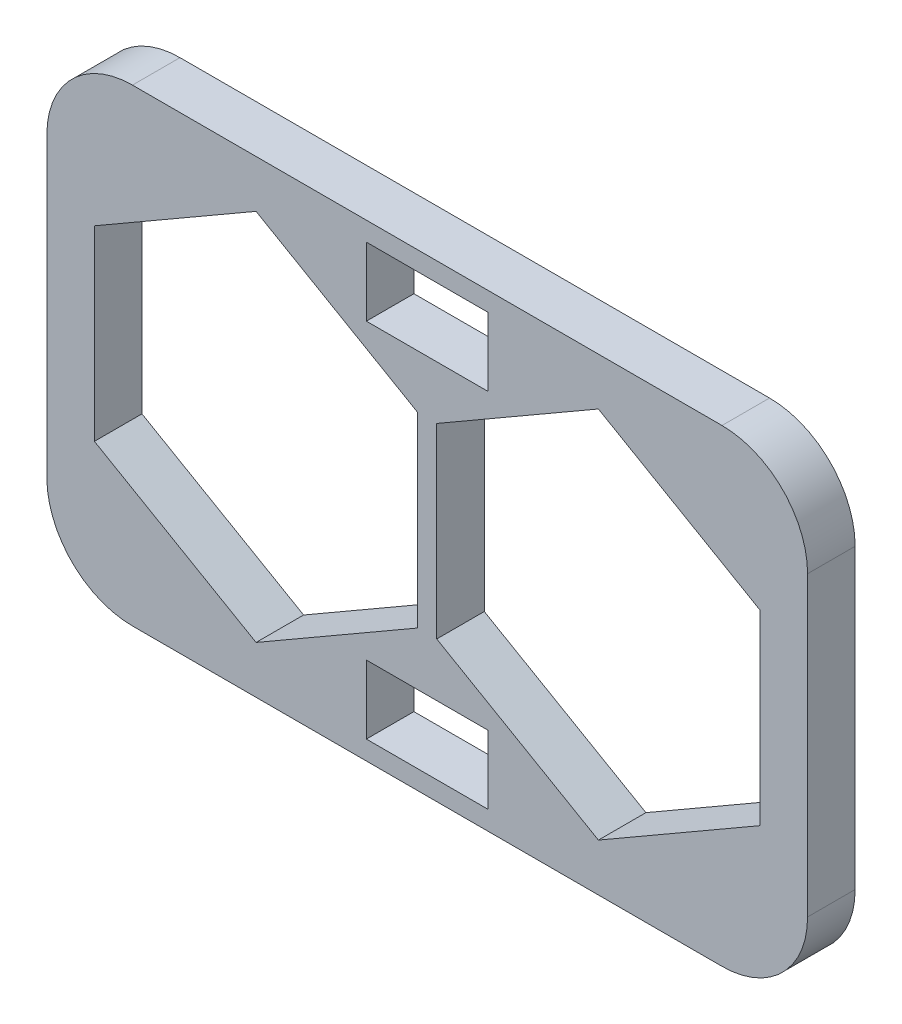
ISO-10303-21;
HEADER;
FILE_DESCRIPTION(('STEP AP214'),'2;1');
FILE_NAME('part.step','',(''),(''),'','','');
FILE_SCHEMA(('AUTOMOTIVE_DESIGN { 1 0 10303 214 1 1 1 1 }'));
ENDSEC;
DATA;
#1=APPLICATION_CONTEXT('core data for automotive mechanical design processes');
#2=APPLICATION_PROTOCOL_DEFINITION('international standard','automotive_design',2000,#1);
#3=PRODUCT_CONTEXT('',#1,'mechanical');
#4=PRODUCT('Part','Part','',(#3));
#5=PRODUCT_RELATED_PRODUCT_CATEGORY('part','',(#4));
#6=PRODUCT_DEFINITION_FORMATION('','',#4);
#7=PRODUCT_DEFINITION_CONTEXT('part definition',#1,'design');
#8=PRODUCT_DEFINITION('design','',#6,#7);
#9=PRODUCT_DEFINITION_SHAPE('','',#8);
#10=(LENGTH_UNIT() NAMED_UNIT(*) SI_UNIT(.MILLI.,.METRE.));
#11=(NAMED_UNIT(*) PLANE_ANGLE_UNIT() SI_UNIT($,.RADIAN.));
#12=(NAMED_UNIT(*) SI_UNIT($,.STERADIAN.) SOLID_ANGLE_UNIT());
#13=UNCERTAINTY_MEASURE_WITH_UNIT(LENGTH_MEASURE(1.E-05),#10,'distance_accuracy_value','');
#14=(GEOMETRIC_REPRESENTATION_CONTEXT(3) GLOBAL_UNCERTAINTY_ASSIGNED_CONTEXT((#13)) GLOBAL_UNIT_ASSIGNED_CONTEXT((#10,
#11,#12)) REPRESENTATION_CONTEXT('',''));
#15=CARTESIAN_POINT('',(0.,0.,0.));
#16=DIRECTION('',(0.,0.,1.));
#17=DIRECTION('',(1.,0.,0.));
#18=AXIS2_PLACEMENT_3D('',#15,#16,#17);
#19=CARTESIAN_POINT('',(-8.25500000000001,9.92499231180402,3.175));
#20=DIRECTION('',(0.,0.,1.));
#21=DIRECTION('',(1.,0.,0.));
#22=AXIS2_PLACEMENT_3D('',#19,#20,#21);
#23=PLANE('',#22);
#24=DIRECTION('',(0.,1.,0.));
#25=VECTOR('',#24,1.);
#26=CARTESIAN_POINT('',(7.36599999999998,-14.369992311804,3.175));
#27=LINE('',#26,#25);
#28=CARTESIAN_POINT('',(7.36599999999998,-14.369992311804,3.175));
#29=VERTEX_POINT('',#28);
#30=CARTESIAN_POINT('',(7.36599999999998,-9.79799231180402,3.175));
#31=VERTEX_POINT('',#30);
#32=EDGE_CURVE('E503',#29,#31,#27,.T.);
#33=ORIENTED_EDGE('',*,*,#32,.T.);
#34=DIRECTION('',(1.,0.,0.));
#35=VECTOR('',#34,1.);
#36=CARTESIAN_POINT('',(7.36599999999998,-9.79799231180402,3.175));
#37=LINE('',#36,#35);
#38=CARTESIAN_POINT('',(15.494,-9.79799231180403,3.175));
#39=VERTEX_POINT('',#38);
#40=EDGE_CURVE('E510',#31,#39,#37,.T.);
#41=ORIENTED_EDGE('',*,*,#40,.T.);
#42=DIRECTION('',(0.,1.,0.));
#43=VECTOR('',#42,1.);
#44=CARTESIAN_POINT('',(15.494,-14.369992311804,3.175));
#45=LINE('',#44,#43);
#46=CARTESIAN_POINT('',(15.494,-14.369992311804,3.175));
#47=VERTEX_POINT('',#46);
#48=EDGE_CURVE('E515',#47,#39,#45,.T.);
#49=ORIENTED_EDGE('',*,*,#48,.F.);
#50=DIRECTION('',(1.,0.,0.));
#51=VECTOR('',#50,1.);
#52=CARTESIAN_POINT('',(7.36599999999998,-14.369992311804,3.175));
#53=LINE('',#52,#51);
#54=EDGE_CURVE('E507',#29,#47,#53,.T.);
#55=ORIENTED_EDGE('',*,*,#54,.F.);
#56=EDGE_LOOP('',(#33,#41,#49,#55));
#57=FACE_BOUND('',#56,.T.);
#58=CARTESIAN_POINT('',(-8.25500000000001,9.92499231180402,3.175));
#59=DIRECTION('',(0.,0.,1.));
#60=DIRECTION('',(1.,0.,0.));
#61=AXIS2_PLACEMENT_3D('',#58,#59,#60);
#62=CIRCLE('',#61,5.715);
#63=CARTESIAN_POINT('',(-8.25499999999997,15.639992311804,3.175));
#64=VERTEX_POINT('',#63);
#65=CARTESIAN_POINT('',(-13.97,9.92499231180402,3.175));
#66=VERTEX_POINT('',#65);
#67=EDGE_CURVE('E717',#64,#66,#62,.T.);
#68=ORIENTED_EDGE('',*,*,#67,.T.);
#69=DIRECTION('',(0.,-1.,0.));
#70=VECTOR('',#69,1.);
#71=CARTESIAN_POINT('',(-13.97,9.92499231180402,3.175));
#72=LINE('',#71,#70);
#73=CARTESIAN_POINT('',(-13.97,-9.92499231180395,3.175));
#74=VERTEX_POINT('',#73);
#75=EDGE_CURVE('E721',#66,#74,#72,.T.);
#76=ORIENTED_EDGE('',*,*,#75,.T.);
#77=CARTESIAN_POINT('',(-8.255,-9.92499231180403,3.175));
#78=DIRECTION('',(0.,0.,1.));
#79=DIRECTION('',(1.,0.,0.));
#80=AXIS2_PLACEMENT_3D('',#77,#78,#79);
#81=CIRCLE('',#80,5.715);
#82=CARTESIAN_POINT('',(-8.25499999999997,-15.639992311804,3.175));
#83=VERTEX_POINT('',#82);
#84=EDGE_CURVE('E725',#74,#83,#81,.T.);
#85=ORIENTED_EDGE('',*,*,#84,.T.);
#86=DIRECTION('',(1.,0.,0.));
#87=VECTOR('',#86,1.);
#88=CARTESIAN_POINT('',(-8.25499999999997,-15.639992311804,3.175));
#89=LINE('',#88,#87);
#90=CARTESIAN_POINT('',(31.115,-15.639992311804,3.175));
#91=VERTEX_POINT('',#90);
#92=EDGE_CURVE('E728',#83,#91,#89,.T.);
#93=ORIENTED_EDGE('',*,*,#92,.T.);
#94=CARTESIAN_POINT('',(31.115,-9.92499231180402,3.175));
#95=DIRECTION('',(0.,0.,-1.));
#96=DIRECTION('',(-1.,0.,0.));
#97=AXIS2_PLACEMENT_3D('',#94,#95,#96);
#98=CIRCLE('',#97,5.715);
#99=CARTESIAN_POINT('',(36.83,-9.92499231180401,3.175));
#100=VERTEX_POINT('',#99);
#101=EDGE_CURVE('E731',#100,#91,#98,.T.);
#102=ORIENTED_EDGE('',*,*,#101,.F.);
#103=DIRECTION('',(0.,-1.,0.));
#104=VECTOR('',#103,1.);
#105=CARTESIAN_POINT('',(36.83,9.92499231180402,3.175));
#106=LINE('',#105,#104);
#107=CARTESIAN_POINT('',(36.83,9.92499231180402,3.175));
#108=VERTEX_POINT('',#107);
#109=EDGE_CURVE('E735',#108,#100,#106,.T.);
#110=ORIENTED_EDGE('',*,*,#109,.F.);
#111=CARTESIAN_POINT('',(31.115,9.92499231180402,3.175));
#112=DIRECTION('',(0.,0.,1.));
#113=DIRECTION('',(1.,0.,0.));
#114=AXIS2_PLACEMENT_3D('',#111,#112,#113);
#115=CIRCLE('',#114,5.715);
#116=CARTESIAN_POINT('',(31.115,15.639992311804,3.175));
#117=VERTEX_POINT('',#116);
#118=EDGE_CURVE('E739',#108,#117,#115,.T.);
#119=ORIENTED_EDGE('',*,*,#118,.T.);
#120=DIRECTION('',(1.,0.,0.));
#121=VECTOR('',#120,1.);
#122=CARTESIAN_POINT('',(-8.25499999999997,15.639992311804,3.175));
#123=LINE('',#122,#121);
#124=EDGE_CURVE('E742',#64,#117,#123,.T.);
#125=ORIENTED_EDGE('',*,*,#124,.F.);
#126=EDGE_LOOP('',(#68,#76,#85,#93,#102,#110,#119,#125));
#127=FACE_BOUND('',#126,.T.);
#128=DIRECTION('',(-0.866025403784438,-0.5,0.));
#129=VECTOR('',#128,1.);
#130=CARTESIAN_POINT('',(0.,12.464992311804,3.175));
#131=LINE('',#130,#129);
#132=CARTESIAN_POINT('',(0.,12.464992311804,3.175));
#133=VERTEX_POINT('',#132);
#134=CARTESIAN_POINT('',(-10.795,6.23249615590201,3.175));
#135=VERTEX_POINT('',#134);
#136=EDGE_CURVE('E657',#133,#135,#131,.T.);
#137=ORIENTED_EDGE('',*,*,#136,.F.);
#138=DIRECTION('',(-0.866025403784439,0.5,0.));
#139=VECTOR('',#138,1.);
#140=CARTESIAN_POINT('',(10.795,6.23249615590201,3.175));
#141=LINE('',#140,#139);
#142=CARTESIAN_POINT('',(10.795,6.23249615590201,3.175));
#143=VERTEX_POINT('',#142);
#144=EDGE_CURVE('E654',#143,#133,#141,.T.);
#145=ORIENTED_EDGE('',*,*,#144,.F.);
#146=DIRECTION('',(0.,1.,0.));
#147=VECTOR('',#146,1.);
#148=CARTESIAN_POINT('',(10.795,-6.23249615590201,3.175));
#149=LINE('',#148,#147);
#150=CARTESIAN_POINT('',(10.795,-6.23249615590201,3.175));
#151=VERTEX_POINT('',#150);
#152=EDGE_CURVE('E671',#151,#143,#149,.T.);
#153=ORIENTED_EDGE('',*,*,#152,.F.);
#154=DIRECTION('',(0.866025403784439,0.5,0.));
#155=VECTOR('',#154,1.);
#156=CARTESIAN_POINT('',(0.,-12.464992311804,3.175));
#157=LINE('',#156,#155);
#158=CARTESIAN_POINT('',(0.,-12.464992311804,3.175));
#159=VERTEX_POINT('',#158);
#160=EDGE_CURVE('E667',#159,#151,#157,.T.);
#161=ORIENTED_EDGE('',*,*,#160,.F.);
#162=DIRECTION('',(0.866025403784438,-0.500000000000001,0.));
#163=VECTOR('',#162,1.);
#164=CARTESIAN_POINT('',(-10.795,-6.23249615590201,3.175));
#165=LINE('',#164,#163);
#166=CARTESIAN_POINT('',(-10.795,-6.23249615590201,3.175));
#167=VERTEX_POINT('',#166);
#168=EDGE_CURVE('E664',#167,#159,#165,.T.);
#169=ORIENTED_EDGE('',*,*,#168,.F.);
#170=DIRECTION('',(0.,-1.,0.));
#171=VECTOR('',#170,1.);
#172=CARTESIAN_POINT('',(-10.795,6.23249615590201,3.175));
#173=LINE('',#172,#171);
#174=EDGE_CURVE('E661',#135,#167,#173,.T.);
#175=ORIENTED_EDGE('',*,*,#174,.F.);
#176=EDGE_LOOP('',(#137,#145,#153,#161,#169,#175));
#177=FACE_BOUND('',#176,.T.);
#178=DIRECTION('',(-0.866025403784439,-0.5,0.));
#179=VECTOR('',#178,1.);
#180=CARTESIAN_POINT('',(22.86,12.464992311804,3.175));
#181=LINE('',#180,#179);
#182=CARTESIAN_POINT('',(22.86,12.464992311804,3.175));
#183=VERTEX_POINT('',#182);
#184=CARTESIAN_POINT('',(12.065,6.23249615590201,3.175));
#185=VERTEX_POINT('',#184);
#186=EDGE_CURVE('E594',#183,#185,#181,.T.);
#187=ORIENTED_EDGE('',*,*,#186,.F.);
#188=DIRECTION('',(-0.866025403784439,0.5,0.));
#189=VECTOR('',#188,1.);
#190=CARTESIAN_POINT('',(33.655,6.23249615590201,3.175));
#191=LINE('',#190,#189);
#192=CARTESIAN_POINT('',(33.655,6.23249615590201,3.175));
#193=VERTEX_POINT('',#192);
#194=EDGE_CURVE('E591',#193,#183,#191,.T.);
#195=ORIENTED_EDGE('',*,*,#194,.F.);
#196=DIRECTION('',(0.,1.,0.));
#197=VECTOR('',#196,1.);
#198=CARTESIAN_POINT('',(33.655,-6.23249615590201,3.175));
#199=LINE('',#198,#197);
#200=CARTESIAN_POINT('',(33.655,-6.23249615590201,3.175));
#201=VERTEX_POINT('',#200);
#202=EDGE_CURVE('E608',#201,#193,#199,.T.);
#203=ORIENTED_EDGE('',*,*,#202,.F.);
#204=DIRECTION('',(0.866025403784438,0.5,0.));
#205=VECTOR('',#204,1.);
#206=CARTESIAN_POINT('',(22.86,-12.464992311804,3.175));
#207=LINE('',#206,#205);
#208=CARTESIAN_POINT('',(22.86,-12.464992311804,3.175));
#209=VERTEX_POINT('',#208);
#210=EDGE_CURVE('E604',#209,#201,#207,.T.);
#211=ORIENTED_EDGE('',*,*,#210,.F.);
#212=DIRECTION('',(0.866025403784439,-0.5,0.));
#213=VECTOR('',#212,1.);
#214=CARTESIAN_POINT('',(12.065,-6.23249615590201,3.175));
#215=LINE('',#214,#213);
#216=CARTESIAN_POINT('',(12.065,-6.23249615590201,3.175));
#217=VERTEX_POINT('',#216);
#218=EDGE_CURVE('E601',#217,#209,#215,.T.);
#219=ORIENTED_EDGE('',*,*,#218,.F.);
#220=DIRECTION('',(0.,-1.,0.));
#221=VECTOR('',#220,1.);
#222=CARTESIAN_POINT('',(12.065,6.23249615590201,3.175));
#223=LINE('',#222,#221);
#224=EDGE_CURVE('E598',#185,#217,#223,.T.);
#225=ORIENTED_EDGE('',*,*,#224,.F.);
#226=EDGE_LOOP('',(#187,#195,#203,#211,#219,#225));
#227=FACE_BOUND('',#226,.T.);
#228=DIRECTION('',(1.,0.,0.));
#229=VECTOR('',#228,1.);
#230=CARTESIAN_POINT('',(7.36599999999999,9.79799231180402,3.175));
#231=LINE('',#230,#229);
#232=CARTESIAN_POINT('',(7.36599999999999,9.79799231180402,3.175));
#233=VERTEX_POINT('',#232);
#234=CARTESIAN_POINT('',(15.494,9.79799231180402,3.175));
#235=VERTEX_POINT('',#234);
#236=EDGE_CURVE('E550',#233,#235,#231,.T.);
#237=ORIENTED_EDGE('',*,*,#236,.F.);
#238=DIRECTION('',(0.,-1.,0.));
#239=VECTOR('',#238,1.);
#240=CARTESIAN_POINT('',(7.36599999999999,14.369992311804,3.175));
#241=LINE('',#240,#239);
#242=CARTESIAN_POINT('',(7.36599999999999,14.369992311804,3.175));
#243=VERTEX_POINT('',#242);
#244=EDGE_CURVE('E547',#243,#233,#241,.T.);
#245=ORIENTED_EDGE('',*,*,#244,.F.);
#246=DIRECTION('',(1.,0.,0.));
#247=VECTOR('',#246,1.);
#248=CARTESIAN_POINT('',(7.36599999999999,14.369992311804,3.175));
#249=LINE('',#248,#247);
#250=CARTESIAN_POINT('',(15.494,14.369992311804,3.175));
#251=VERTEX_POINT('',#250);
#252=EDGE_CURVE('E558',#243,#251,#249,.T.);
#253=ORIENTED_EDGE('',*,*,#252,.T.);
#254=DIRECTION('',(0.,-1.,0.));
#255=VECTOR('',#254,1.);
#256=CARTESIAN_POINT('',(15.494,14.369992311804,3.175));
#257=LINE('',#256,#255);
#258=EDGE_CURVE('E554',#251,#235,#257,.T.);
#259=ORIENTED_EDGE('',*,*,#258,.T.);
#260=EDGE_LOOP('',(#237,#245,#253,#259));
#261=FACE_BOUND('',#260,.T.);
#262=ADVANCED_FACE('F315',(#57,#127,#177,#227,#261),#23,.T.);
#263=CARTESIAN_POINT('',(-8.25500000000001,9.92499231180402,0.));
#264=DIRECTION('',(0.,0.,1.));
#265=DIRECTION('',(1.,0.,0.));
#266=AXIS2_PLACEMENT_3D('',#263,#264,#265);
#267=PLANE('',#266);
#268=DIRECTION('',(1.,0.,0.));
#269=VECTOR('',#268,1.);
#270=CARTESIAN_POINT('',(7.36599999999998,-9.79799231180402,0.));
#271=LINE('',#270,#269);
#272=CARTESIAN_POINT('',(7.36599999999999,-9.79799231180403,0.));
#273=VERTEX_POINT('',#272);
#274=CARTESIAN_POINT('',(15.494,-9.79799231180403,0.));
#275=VERTEX_POINT('',#274);
#276=EDGE_CURVE('E532',#273,#275,#271,.T.);
#277=ORIENTED_EDGE('',*,*,#276,.F.);
#278=DIRECTION('',(0.,1.,0.));
#279=VECTOR('',#278,1.);
#280=CARTESIAN_POINT('',(7.36599999999998,-14.369992311804,0.));
#281=LINE('',#280,#279);
#282=CARTESIAN_POINT('',(7.36599999999998,-14.369992311804,0.));
#283=VERTEX_POINT('',#282);
#284=EDGE_CURVE('E339',#283,#273,#281,.T.);
#285=ORIENTED_EDGE('',*,*,#284,.F.);
#286=DIRECTION('',(1.,0.,0.));
#287=VECTOR('',#286,1.);
#288=CARTESIAN_POINT('',(7.36599999999998,-14.369992311804,0.));
#289=LINE('',#288,#287);
#290=CARTESIAN_POINT('',(15.494,-14.369992311804,0.));
#291=VERTEX_POINT('',#290);
#292=EDGE_CURVE('E519',#283,#291,#289,.T.);
#293=ORIENTED_EDGE('',*,*,#292,.T.);
#294=DIRECTION('',(0.,1.,0.));
#295=VECTOR('',#294,1.);
#296=CARTESIAN_POINT('',(15.494,-14.369992311804,0.));
#297=LINE('',#296,#295);
#298=EDGE_CURVE('E523',#291,#275,#297,.T.);
#299=ORIENTED_EDGE('',*,*,#298,.T.);
#300=EDGE_LOOP('',(#277,#285,#293,#299));
#301=FACE_BOUND('',#300,.T.);
#302=DIRECTION('',(-0.866025403784439,0.5,0.));
#303=VECTOR('',#302,1.);
#304=CARTESIAN_POINT('',(33.655,6.23249615590201,0.));
#305=LINE('',#304,#303);
#306=CARTESIAN_POINT('',(33.655,6.23249615590201,0.));
#307=VERTEX_POINT('',#306);
#308=CARTESIAN_POINT('',(22.86,12.464992311804,0.));
#309=VERTEX_POINT('',#308);
#310=EDGE_CURVE('E590',#307,#309,#305,.T.);
#311=ORIENTED_EDGE('',*,*,#310,.T.);
#312=DIRECTION('',(-0.866025403784439,-0.5,0.));
#313=VECTOR('',#312,1.);
#314=CARTESIAN_POINT('',(22.86,12.464992311804,0.));
#315=LINE('',#314,#313);
#316=CARTESIAN_POINT('',(12.065,6.23249615590201,0.));
#317=VERTEX_POINT('',#316);
#318=EDGE_CURVE('E615',#309,#317,#315,.T.);
#319=ORIENTED_EDGE('',*,*,#318,.T.);
#320=DIRECTION('',(0.,-1.,0.));
#321=VECTOR('',#320,1.);
#322=CARTESIAN_POINT('',(12.065,6.23249615590201,0.));
#323=LINE('',#322,#321);
#324=CARTESIAN_POINT('',(12.065,-6.23249615590201,0.));
#325=VERTEX_POINT('',#324);
#326=EDGE_CURVE('E619',#317,#325,#323,.T.);
#327=ORIENTED_EDGE('',*,*,#326,.T.);
#328=DIRECTION('',(0.866025403784439,-0.5,0.));
#329=VECTOR('',#328,1.);
#330=CARTESIAN_POINT('',(12.065,-6.23249615590201,0.));
#331=LINE('',#330,#329);
#332=CARTESIAN_POINT('',(22.86,-12.464992311804,0.));
#333=VERTEX_POINT('',#332);
#334=EDGE_CURVE('E623',#325,#333,#331,.T.);
#335=ORIENTED_EDGE('',*,*,#334,.T.);
#336=DIRECTION('',(0.866025403784438,0.5,0.));
#337=VECTOR('',#336,1.);
#338=CARTESIAN_POINT('',(22.86,-12.464992311804,0.));
#339=LINE('',#338,#337);
#340=CARTESIAN_POINT('',(33.655,-6.23249615590201,0.));
#341=VERTEX_POINT('',#340);
#342=EDGE_CURVE('E627',#333,#341,#339,.T.);
#343=ORIENTED_EDGE('',*,*,#342,.T.);
#344=DIRECTION('',(0.,1.,0.));
#345=VECTOR('',#344,1.);
#346=CARTESIAN_POINT('',(33.655,-6.23249615590201,0.));
#347=LINE('',#346,#345);
#348=EDGE_CURVE('E595',#341,#307,#347,.T.);
#349=ORIENTED_EDGE('',*,*,#348,.T.);
#350=EDGE_LOOP('',(#311,#319,#327,#335,#343,#349));
#351=FACE_BOUND('',#350,.T.);
#352=CARTESIAN_POINT('',(-8.25500000000001,9.92499231180402,0.));
#353=DIRECTION('',(0.,0.,1.));
#354=DIRECTION('',(1.,0.,0.));
#355=AXIS2_PLACEMENT_3D('',#352,#353,#354);
#356=CIRCLE('',#355,5.715);
#357=CARTESIAN_POINT('',(-8.25499999999997,15.639992311804,0.));
#358=VERTEX_POINT('',#357);
#359=CARTESIAN_POINT('',(-13.97,9.92499231180402,0.));
#360=VERTEX_POINT('',#359);
#361=EDGE_CURVE('E716',#358,#360,#356,.T.);
#362=ORIENTED_EDGE('',*,*,#361,.F.);
#363=DIRECTION('',(1.,0.,0.));
#364=VECTOR('',#363,1.);
#365=CARTESIAN_POINT('',(-8.25499999999997,15.639992311804,0.));
#366=LINE('',#365,#364);
#367=CARTESIAN_POINT('',(31.115,15.639992311804,0.));
#368=VERTEX_POINT('',#367);
#369=EDGE_CURVE('E722',#358,#368,#366,.T.);
#370=ORIENTED_EDGE('',*,*,#369,.T.);
#371=CARTESIAN_POINT('',(31.115,9.92499231180402,0.));
#372=DIRECTION('',(0.,0.,1.));
#373=DIRECTION('',(1.,0.,0.));
#374=AXIS2_PLACEMENT_3D('',#371,#372,#373);
#375=CIRCLE('',#374,5.715);
#376=CARTESIAN_POINT('',(36.83,9.92499231180402,0.));
#377=VERTEX_POINT('',#376);
#378=EDGE_CURVE('E768',#377,#368,#375,.T.);
#379=ORIENTED_EDGE('',*,*,#378,.F.);
#380=DIRECTION('',(0.,-1.,0.));
#381=VECTOR('',#380,1.);
#382=CARTESIAN_POINT('',(36.83,9.92499231180402,0.));
#383=LINE('',#382,#381);
#384=CARTESIAN_POINT('',(36.83,-9.92499231180401,0.));
#385=VERTEX_POINT('',#384);
#386=EDGE_CURVE('E764',#377,#385,#383,.T.);
#387=ORIENTED_EDGE('',*,*,#386,.T.);
#388=CARTESIAN_POINT('',(31.115,-9.92499231180402,0.));
#389=DIRECTION('',(0.,0.,-1.));
#390=DIRECTION('',(-1.,0.,0.));
#391=AXIS2_PLACEMENT_3D('',#388,#389,#390);
#392=CIRCLE('',#391,5.715);
#393=CARTESIAN_POINT('',(31.115,-15.639992311804,0.));
#394=VERTEX_POINT('',#393);
#395=EDGE_CURVE('E760',#385,#394,#392,.T.);
#396=ORIENTED_EDGE('',*,*,#395,.T.);
#397=DIRECTION('',(1.,0.,0.));
#398=VECTOR('',#397,1.);
#399=CARTESIAN_POINT('',(-8.25499999999997,-15.639992311804,0.));
#400=LINE('',#399,#398);
#401=CARTESIAN_POINT('',(-8.25499999999997,-15.639992311804,0.));
#402=VERTEX_POINT('',#401);
#403=EDGE_CURVE('E756',#402,#394,#400,.T.);
#404=ORIENTED_EDGE('',*,*,#403,.F.);
#405=CARTESIAN_POINT('',(-8.255,-9.92499231180403,0.));
#406=DIRECTION('',(0.,0.,1.));
#407=DIRECTION('',(1.,0.,0.));
#408=AXIS2_PLACEMENT_3D('',#405,#406,#407);
#409=CIRCLE('',#408,5.715);
#410=CARTESIAN_POINT('',(-13.97,-9.92499231180395,0.));
#411=VERTEX_POINT('',#410);
#412=EDGE_CURVE('E753',#411,#402,#409,.T.);
#413=ORIENTED_EDGE('',*,*,#412,.F.);
#414=DIRECTION('',(0.,-1.,0.));
#415=VECTOR('',#414,1.);
#416=CARTESIAN_POINT('',(-13.97,9.92499231180402,0.));
#417=LINE('',#416,#415);
#418=EDGE_CURVE('E750',#360,#411,#417,.T.);
#419=ORIENTED_EDGE('',*,*,#418,.F.);
#420=EDGE_LOOP('',(#362,#370,#379,#387,#396,#404,#413,#419));
#421=FACE_BOUND('',#420,.T.);
#422=DIRECTION('',(-0.866025403784439,0.5,0.));
#423=VECTOR('',#422,1.);
#424=CARTESIAN_POINT('',(10.795,6.23249615590201,0.));
#425=LINE('',#424,#423);
#426=CARTESIAN_POINT('',(10.795,6.23249615590201,0.));
#427=VERTEX_POINT('',#426);
#428=CARTESIAN_POINT('',(0.,12.464992311804,0.));
#429=VERTEX_POINT('',#428);
#430=EDGE_CURVE('E653',#427,#429,#425,.T.);
#431=ORIENTED_EDGE('',*,*,#430,.T.);
#432=DIRECTION('',(-0.866025403784438,-0.5,0.));
#433=VECTOR('',#432,1.);
#434=CARTESIAN_POINT('',(0.,12.464992311804,0.));
#435=LINE('',#434,#433);
#436=CARTESIAN_POINT('',(-10.795,6.23249615590201,0.));
#437=VERTEX_POINT('',#436);
#438=EDGE_CURVE('E678',#429,#437,#435,.T.);
#439=ORIENTED_EDGE('',*,*,#438,.T.);
#440=DIRECTION('',(0.,-1.,0.));
#441=VECTOR('',#440,1.);
#442=CARTESIAN_POINT('',(-10.795,6.23249615590201,0.));
#443=LINE('',#442,#441);
#444=CARTESIAN_POINT('',(-10.795,-6.23249615590201,0.));
#445=VERTEX_POINT('',#444);
#446=EDGE_CURVE('E682',#437,#445,#443,.T.);
#447=ORIENTED_EDGE('',*,*,#446,.T.);
#448=DIRECTION('',(0.866025403784438,-0.500000000000001,0.));
#449=VECTOR('',#448,1.);
#450=CARTESIAN_POINT('',(-10.795,-6.23249615590201,0.));
#451=LINE('',#450,#449);
#452=CARTESIAN_POINT('',(0.,-12.464992311804,0.));
#453=VERTEX_POINT('',#452);
#454=EDGE_CURVE('E686',#445,#453,#451,.T.);
#455=ORIENTED_EDGE('',*,*,#454,.T.);
#456=DIRECTION('',(0.866025403784439,0.5,0.));
#457=VECTOR('',#456,1.);
#458=CARTESIAN_POINT('',(0.,-12.464992311804,0.));
#459=LINE('',#458,#457);
#460=CARTESIAN_POINT('',(10.795,-6.23249615590201,0.));
#461=VERTEX_POINT('',#460);
#462=EDGE_CURVE('E690',#453,#461,#459,.T.);
#463=ORIENTED_EDGE('',*,*,#462,.T.);
#464=DIRECTION('',(0.,1.,0.));
#465=VECTOR('',#464,1.);
#466=CARTESIAN_POINT('',(10.795,-6.23249615590201,0.));
#467=LINE('',#466,#465);
#468=EDGE_CURVE('E658',#461,#427,#467,.T.);
#469=ORIENTED_EDGE('',*,*,#468,.T.);
#470=EDGE_LOOP('',(#431,#439,#447,#455,#463,#469));
#471=FACE_BOUND('',#470,.T.);
#472=DIRECTION('',(0.,-1.,0.));
#473=VECTOR('',#472,1.);
#474=CARTESIAN_POINT('',(7.36599999999999,14.369992311804,0.));
#475=LINE('',#474,#473);
#476=CARTESIAN_POINT('',(7.36599999999999,14.369992311804,0.));
#477=VERTEX_POINT('',#476);
#478=CARTESIAN_POINT('',(7.36599999999999,9.79799231180402,0.));
#479=VERTEX_POINT('',#478);
#480=EDGE_CURVE('E541',#477,#479,#475,.T.);
#481=ORIENTED_EDGE('',*,*,#480,.T.);
#482=DIRECTION('',(1.,0.,0.));
#483=VECTOR('',#482,1.);
#484=CARTESIAN_POINT('',(7.36599999999999,9.79799231180402,0.));
#485=LINE('',#484,#483);
#486=CARTESIAN_POINT('',(15.494,9.79799231180402,0.));
#487=VERTEX_POINT('',#486);
#488=EDGE_CURVE('E566',#479,#487,#485,.T.);
#489=ORIENTED_EDGE('',*,*,#488,.T.);
#490=DIRECTION('',(0.,-1.,0.));
#491=VECTOR('',#490,1.);
#492=CARTESIAN_POINT('',(15.494,14.369992311804,0.));
#493=LINE('',#492,#491);
#494=CARTESIAN_POINT('',(15.494,14.369992311804,0.));
#495=VERTEX_POINT('',#494);
#496=EDGE_CURVE('E570',#495,#487,#493,.T.);
#497=ORIENTED_EDGE('',*,*,#496,.F.);
#498=DIRECTION('',(1.,0.,0.));
#499=VECTOR('',#498,1.);
#500=CARTESIAN_POINT('',(7.36599999999999,14.369992311804,0.));
#501=LINE('',#500,#499);
#502=EDGE_CURVE('E551',#477,#495,#501,.T.);
#503=ORIENTED_EDGE('',*,*,#502,.F.);
#504=EDGE_LOOP('',(#481,#489,#497,#503));
#505=FACE_BOUND('',#504,.T.);
#506=ADVANCED_FACE('F804',(#301,#351,#421,#471,#505),#267,.F.);
#507=CARTESIAN_POINT('',(-8.25500000000001,9.92499231180402,3.175));
#508=DIRECTION('',(0.,0.,-1.));
#509=DIRECTION('',(-1.,0.,0.));
#510=AXIS2_PLACEMENT_3D('',#507,#508,#509);
#511=CYLINDRICAL_SURFACE('',#510,5.715);
#512=ORIENTED_EDGE('',*,*,#361,.T.);
#513=DIRECTION('',(0.,0.,-1.));
#514=VECTOR('',#513,1.);
#515=CARTESIAN_POINT('',(-13.97,9.92499231180402,3.175));
#516=LINE('',#515,#514);
#517=EDGE_CURVE('E12',#66,#360,#516,.T.);
#518=ORIENTED_EDGE('',*,*,#517,.F.);
#519=ORIENTED_EDGE('',*,*,#67,.F.);
#520=DIRECTION('',(0.,0.,-1.));
#521=VECTOR('',#520,1.);
#522=CARTESIAN_POINT('',(-8.25499999999997,15.639992311804,3.175));
#523=LINE('',#522,#521);
#524=EDGE_CURVE('E746',#64,#358,#523,.T.);
#525=ORIENTED_EDGE('',*,*,#524,.T.);
#526=EDGE_LOOP('',(#512,#518,#519,#525));
#527=FACE_BOUND('',#526,.T.);
#528=ADVANCED_FACE('F317',(#527),#511,.T.);
#529=CARTESIAN_POINT('',(-13.97,9.92499231180402,3.175));
#530=DIRECTION('',(1.,0.,0.));
#531=DIRECTION('',(0.,1.,0.));
#532=AXIS2_PLACEMENT_3D('',#529,#530,#531);
#533=PLANE('',#532);
#534=ORIENTED_EDGE('',*,*,#418,.T.);
#535=DIRECTION('',(0.,0.,-1.));
#536=VECTOR('',#535,1.);
#537=CARTESIAN_POINT('',(-13.97,-9.92499231180395,3.175));
#538=LINE('',#537,#536);
#539=EDGE_CURVE('E324',#74,#411,#538,.T.);
#540=ORIENTED_EDGE('',*,*,#539,.F.);
#541=ORIENTED_EDGE('',*,*,#75,.F.);
#542=ORIENTED_EDGE('',*,*,#517,.T.);
#543=EDGE_LOOP('',(#534,#540,#541,#542));
#544=FACE_BOUND('',#543,.T.);
#545=ADVANCED_FACE('F817',(#544),#533,.F.);
#546=CARTESIAN_POINT('',(-8.255,-9.92499231180403,3.175));
#547=DIRECTION('',(0.,0.,-1.));
#548=DIRECTION('',(-1.,0.,0.));
#549=AXIS2_PLACEMENT_3D('',#546,#547,#548);
#550=CYLINDRICAL_SURFACE('',#549,5.715);
#551=ORIENTED_EDGE('',*,*,#412,.T.);
#552=DIRECTION('',(0.,0.,-1.));
#553=VECTOR('',#552,1.);
#554=CARTESIAN_POINT('',(-8.25499999999997,-15.639992311804,3.175));
#555=LINE('',#554,#553);
#556=EDGE_CURVE('E789',#83,#402,#555,.T.);
#557=ORIENTED_EDGE('',*,*,#556,.F.);
#558=ORIENTED_EDGE('',*,*,#84,.F.);
#559=ORIENTED_EDGE('',*,*,#539,.T.);
#560=EDGE_LOOP('',(#551,#557,#558,#559));
#561=FACE_BOUND('',#560,.T.);
#562=ADVANCED_FACE('F798',(#561),#550,.T.);
#563=CARTESIAN_POINT('',(-8.25499999999997,-15.639992311804,3.175));
#564=DIRECTION('',(0.,1.,0.));
#565=DIRECTION('',(-1.,0.,0.));
#566=AXIS2_PLACEMENT_3D('',#563,#564,#565);
#567=PLANE('',#566);
#568=ORIENTED_EDGE('',*,*,#403,.T.);
#569=DIRECTION('',(0.,0.,-1.));
#570=VECTOR('',#569,1.);
#571=CARTESIAN_POINT('',(31.115,-15.639992311804,3.175));
#572=LINE('',#571,#570);
#573=EDGE_CURVE('E786',#91,#394,#572,.T.);
#574=ORIENTED_EDGE('',*,*,#573,.F.);
#575=ORIENTED_EDGE('',*,*,#92,.F.);
#576=ORIENTED_EDGE('',*,*,#556,.T.);
#577=EDGE_LOOP('',(#568,#574,#575,#576));
#578=FACE_BOUND('',#577,.T.);
#579=ADVANCED_FACE('F809',(#578),#567,.F.);
#580=CARTESIAN_POINT('',(31.115,-9.92499231180402,3.175));
#581=DIRECTION('',(0.,0.,-1.));
#582=DIRECTION('',(-1.,0.,0.));
#583=AXIS2_PLACEMENT_3D('',#580,#581,#582);
#584=CYLINDRICAL_SURFACE('',#583,5.715);
#585=ORIENTED_EDGE('',*,*,#395,.F.);
#586=DIRECTION('',(0.,0.,-1.));
#587=VECTOR('',#586,1.);
#588=CARTESIAN_POINT('',(36.83,-9.92499231180401,3.175));
#589=LINE('',#588,#587);
#590=EDGE_CURVE('E783',#100,#385,#589,.T.);
#591=ORIENTED_EDGE('',*,*,#590,.F.);
#592=ORIENTED_EDGE('',*,*,#101,.T.);
#593=ORIENTED_EDGE('',*,*,#573,.T.);
#594=EDGE_LOOP('',(#585,#591,#592,#593));
#595=FACE_BOUND('',#594,.T.);
#596=ADVANCED_FACE('F831',(#595),#584,.T.);
#597=CARTESIAN_POINT('',(36.83,9.92499231180402,3.175));
#598=DIRECTION('',(1.,0.,0.));
#599=DIRECTION('',(0.,0.,-1.));
#600=AXIS2_PLACEMENT_3D('',#597,#598,#599);
#601=PLANE('',#600);
#602=ORIENTED_EDGE('',*,*,#386,.F.);
#603=DIRECTION('',(0.,0.,-1.));
#604=VECTOR('',#603,1.);
#605=CARTESIAN_POINT('',(36.83,9.92499231180402,3.175));
#606=LINE('',#605,#604);
#607=EDGE_CURVE('E780',#108,#377,#606,.T.);
#608=ORIENTED_EDGE('',*,*,#607,.F.);
#609=ORIENTED_EDGE('',*,*,#109,.T.);
#610=ORIENTED_EDGE('',*,*,#590,.T.);
#611=EDGE_LOOP('',(#602,#608,#609,#610));
#612=FACE_BOUND('',#611,.T.);
#613=ADVANCED_FACE('F829',(#612),#601,.T.);
#614=CARTESIAN_POINT('',(31.115,9.92499231180402,3.175));
#615=DIRECTION('',(0.,0.,-1.));
#616=DIRECTION('',(-1.,0.,0.));
#617=AXIS2_PLACEMENT_3D('',#614,#615,#616);
#618=CYLINDRICAL_SURFACE('',#617,5.715);
#619=ORIENTED_EDGE('',*,*,#378,.T.);
#620=DIRECTION('',(0.,0.,-1.));
#621=VECTOR('',#620,1.);
#622=CARTESIAN_POINT('',(31.115,15.639992311804,3.175));
#623=LINE('',#622,#621);
#624=EDGE_CURVE('E777',#117,#368,#623,.T.);
#625=ORIENTED_EDGE('',*,*,#624,.F.);
#626=ORIENTED_EDGE('',*,*,#118,.F.);
#627=ORIENTED_EDGE('',*,*,#607,.T.);
#628=EDGE_LOOP('',(#619,#625,#626,#627));
#629=FACE_BOUND('',#628,.T.);
#630=ADVANCED_FACE('F826',(#629),#618,.T.);
#631=CARTESIAN_POINT('',(-8.25499999999997,15.639992311804,3.175));
#632=DIRECTION('',(0.,1.,0.));
#633=DIRECTION('',(0.,0.,1.));
#634=AXIS2_PLACEMENT_3D('',#631,#632,#633);
#635=PLANE('',#634);
#636=ORIENTED_EDGE('',*,*,#369,.F.);
#637=ORIENTED_EDGE('',*,*,#524,.F.);
#638=ORIENTED_EDGE('',*,*,#124,.T.);
#639=ORIENTED_EDGE('',*,*,#624,.T.);
#640=EDGE_LOOP('',(#636,#637,#638,#639));
#641=FACE_BOUND('',#640,.T.);
#642=ADVANCED_FACE('F822',(#641),#635,.T.);
#643=CARTESIAN_POINT('',(10.795,6.23249615590201,3.175));
#644=DIRECTION('',(-0.5,-0.866025403784439,0.));
#645=DIRECTION('',(0.866025403784439,-0.5,0.));
#646=AXIS2_PLACEMENT_3D('',#643,#644,#645);
#647=PLANE('',#646);
#648=ORIENTED_EDGE('',*,*,#430,.F.);
#649=DIRECTION('',(0.,0.,-1.));
#650=VECTOR('',#649,1.);
#651=CARTESIAN_POINT('',(10.795,6.23249615590201,3.175));
#652=LINE('',#651,#650);
#653=EDGE_CURVE('E674',#143,#427,#652,.T.);
#654=ORIENTED_EDGE('',*,*,#653,.F.);
#655=ORIENTED_EDGE('',*,*,#144,.T.);
#656=DIRECTION('',(0.,0.,-1.));
#657=VECTOR('',#656,1.);
#658=CARTESIAN_POINT('',(0.,12.464992311804,3.175));
#659=LINE('',#658,#657);
#660=EDGE_CURVE('E712',#133,#429,#659,.T.);
#661=ORIENTED_EDGE('',*,*,#660,.T.);
#662=EDGE_LOOP('',(#648,#654,#655,#661));
#663=FACE_BOUND('',#662,.T.);
#664=ADVANCED_FACE('F848',(#663),#647,.T.);
#665=CARTESIAN_POINT('',(0.,12.464992311804,3.175));
#666=DIRECTION('',(0.5,-0.866025403784438,0.));
#667=DIRECTION('',(0.866025403784438,0.5,0.));
#668=AXIS2_PLACEMENT_3D('',#665,#666,#667);
#669=PLANE('',#668);
#670=ORIENTED_EDGE('',*,*,#438,.F.);
#671=ORIENTED_EDGE('',*,*,#660,.F.);
#672=ORIENTED_EDGE('',*,*,#136,.T.);
#673=DIRECTION('',(0.,0.,-1.));
#674=VECTOR('',#673,1.);
#675=CARTESIAN_POINT('',(-10.795,6.23249615590201,3.175));
#676=LINE('',#675,#674);
#677=EDGE_CURVE('E709',#135,#437,#676,.T.);
#678=ORIENTED_EDGE('',*,*,#677,.T.);
#679=EDGE_LOOP('',(#670,#671,#672,#678));
#680=FACE_BOUND('',#679,.T.);
#681=ADVANCED_FACE('F868',(#680),#669,.T.);
#682=CARTESIAN_POINT('',(-10.795,6.23249615590201,3.175));
#683=DIRECTION('',(1.,0.,0.));
#684=DIRECTION('',(0.,0.,-1.));
#685=AXIS2_PLACEMENT_3D('',#682,#683,#684);
#686=PLANE('',#685);
#687=ORIENTED_EDGE('',*,*,#446,.F.);
#688=ORIENTED_EDGE('',*,*,#677,.F.);
#689=ORIENTED_EDGE('',*,*,#174,.T.);
#690=DIRECTION('',(0.,0.,-1.));
#691=VECTOR('',#690,1.);
#692=CARTESIAN_POINT('',(-10.795,-6.23249615590201,3.175));
#693=LINE('',#692,#691);
#694=EDGE_CURVE('E706',#167,#445,#693,.T.);
#695=ORIENTED_EDGE('',*,*,#694,.T.);
#696=EDGE_LOOP('',(#687,#688,#689,#695));
#697=FACE_BOUND('',#696,.T.);
#698=ADVANCED_FACE('F875',(#697),#686,.T.);
#699=CARTESIAN_POINT('',(-10.795,-6.23249615590201,3.175));
#700=DIRECTION('',(0.500000000000001,0.866025403784438,0.));
#701=DIRECTION('',(-0.866025403784438,0.500000000000001,0.));
#702=AXIS2_PLACEMENT_3D('',#699,#700,#701);
#703=PLANE('',#702);
#704=ORIENTED_EDGE('',*,*,#454,.F.);
#705=ORIENTED_EDGE('',*,*,#694,.F.);
#706=ORIENTED_EDGE('',*,*,#168,.T.);
#707=DIRECTION('',(0.,0.,-1.));
#708=VECTOR('',#707,1.);
#709=CARTESIAN_POINT('',(0.,-12.464992311804,3.175));
#710=LINE('',#709,#708);
#711=EDGE_CURVE('E703',#159,#453,#710,.T.);
#712=ORIENTED_EDGE('',*,*,#711,.T.);
#713=EDGE_LOOP('',(#704,#705,#706,#712));
#714=FACE_BOUND('',#713,.T.);
#715=ADVANCED_FACE('F882',(#714),#703,.T.);
#716=CARTESIAN_POINT('',(0.,-12.464992311804,3.175));
#717=DIRECTION('',(-0.5,0.866025403784439,0.));
#718=DIRECTION('',(-0.866025403784439,-0.5,0.));
#719=AXIS2_PLACEMENT_3D('',#716,#717,#718);
#720=PLANE('',#719);
#721=ORIENTED_EDGE('',*,*,#462,.F.);
#722=ORIENTED_EDGE('',*,*,#711,.F.);
#723=ORIENTED_EDGE('',*,*,#160,.T.);
#724=DIRECTION('',(0.,0.,-1.));
#725=VECTOR('',#724,1.);
#726=CARTESIAN_POINT('',(10.795,-6.23249615590201,3.175));
#727=LINE('',#726,#725);
#728=EDGE_CURVE('E700',#151,#461,#727,.T.);
#729=ORIENTED_EDGE('',*,*,#728,.T.);
#730=EDGE_LOOP('',(#721,#722,#723,#729));
#731=FACE_BOUND('',#730,.T.);
#732=ADVANCED_FACE('F890',(#731),#720,.T.);
#733=CARTESIAN_POINT('',(10.795,-6.23249615590201,3.175));
#734=DIRECTION('',(-1.,0.,0.));
#735=DIRECTION('',(0.,-1.,0.));
#736=AXIS2_PLACEMENT_3D('',#733,#734,#735);
#737=PLANE('',#736);
#738=ORIENTED_EDGE('',*,*,#468,.F.);
#739=ORIENTED_EDGE('',*,*,#728,.F.);
#740=ORIENTED_EDGE('',*,*,#152,.T.);
#741=ORIENTED_EDGE('',*,*,#653,.T.);
#742=EDGE_LOOP('',(#738,#739,#740,#741));
#743=FACE_BOUND('',#742,.T.);
#744=ADVANCED_FACE('F898',(#743),#737,.T.);
#745=CARTESIAN_POINT('',(33.655,6.23249615590201,3.175));
#746=DIRECTION('',(-0.5,-0.866025403784439,0.));
#747=DIRECTION('',(0.866025403784439,-0.5,0.));
#748=AXIS2_PLACEMENT_3D('',#745,#746,#747);
#749=PLANE('',#748);
#750=ORIENTED_EDGE('',*,*,#310,.F.);
#751=DIRECTION('',(0.,0.,-1.));
#752=VECTOR('',#751,1.);
#753=CARTESIAN_POINT('',(33.655,6.23249615590201,3.175));
#754=LINE('',#753,#752);
#755=EDGE_CURVE('E611',#193,#307,#754,.T.);
#756=ORIENTED_EDGE('',*,*,#755,.F.);
#757=ORIENTED_EDGE('',*,*,#194,.T.);
#758=DIRECTION('',(0.,0.,-1.));
#759=VECTOR('',#758,1.);
#760=CARTESIAN_POINT('',(22.86,12.464992311804,3.175));
#761=LINE('',#760,#759);
#762=EDGE_CURVE('E649',#183,#309,#761,.T.);
#763=ORIENTED_EDGE('',*,*,#762,.T.);
#764=EDGE_LOOP('',(#750,#756,#757,#763));
#765=FACE_BOUND('',#764,.T.);
#766=ADVANCED_FACE('F906',(#765),#749,.T.);
#767=CARTESIAN_POINT('',(22.86,12.464992311804,3.175));
#768=DIRECTION('',(0.5,-0.866025403784439,0.));
#769=DIRECTION('',(0.866025403784439,0.5,0.));
#770=AXIS2_PLACEMENT_3D('',#767,#768,#769);
#771=PLANE('',#770);
#772=ORIENTED_EDGE('',*,*,#318,.F.);
#773=ORIENTED_EDGE('',*,*,#762,.F.);
#774=ORIENTED_EDGE('',*,*,#186,.T.);
#775=DIRECTION('',(0.,0.,-1.));
#776=VECTOR('',#775,1.);
#777=CARTESIAN_POINT('',(12.065,6.23249615590201,3.175));
#778=LINE('',#777,#776);
#779=EDGE_CURVE('E646',#185,#317,#778,.T.);
#780=ORIENTED_EDGE('',*,*,#779,.T.);
#781=EDGE_LOOP('',(#772,#773,#774,#780));
#782=FACE_BOUND('',#781,.T.);
#783=ADVANCED_FACE('F914',(#782),#771,.T.);
#784=CARTESIAN_POINT('',(12.065,6.23249615590201,3.175));
#785=DIRECTION('',(1.,0.,0.));
#786=DIRECTION('',(0.,0.,-1.));
#787=AXIS2_PLACEMENT_3D('',#784,#785,#786);
#788=PLANE('',#787);
#789=ORIENTED_EDGE('',*,*,#326,.F.);
#790=ORIENTED_EDGE('',*,*,#779,.F.);
#791=ORIENTED_EDGE('',*,*,#224,.T.);
#792=DIRECTION('',(0.,0.,-1.));
#793=VECTOR('',#792,1.);
#794=CARTESIAN_POINT('',(12.065,-6.23249615590201,3.175));
#795=LINE('',#794,#793);
#796=EDGE_CURVE('E643',#217,#325,#795,.T.);
#797=ORIENTED_EDGE('',*,*,#796,.T.);
#798=EDGE_LOOP('',(#789,#790,#791,#797));
#799=FACE_BOUND('',#798,.T.);
#800=ADVANCED_FACE('F922',(#799),#788,.T.);
#801=CARTESIAN_POINT('',(12.065,-6.23249615590201,3.175));
#802=DIRECTION('',(0.5,0.866025403784439,0.));
#803=DIRECTION('',(-0.866025403784439,0.5,0.));
#804=AXIS2_PLACEMENT_3D('',#801,#802,#803);
#805=PLANE('',#804);
#806=ORIENTED_EDGE('',*,*,#334,.F.);
#807=ORIENTED_EDGE('',*,*,#796,.F.);
#808=ORIENTED_EDGE('',*,*,#218,.T.);
#809=DIRECTION('',(0.,0.,-1.));
#810=VECTOR('',#809,1.);
#811=CARTESIAN_POINT('',(22.86,-12.464992311804,3.175));
#812=LINE('',#811,#810);
#813=EDGE_CURVE('E640',#209,#333,#812,.T.);
#814=ORIENTED_EDGE('',*,*,#813,.T.);
#815=EDGE_LOOP('',(#806,#807,#808,#814));
#816=FACE_BOUND('',#815,.T.);
#817=ADVANCED_FACE('F930',(#816),#805,.T.);
#818=CARTESIAN_POINT('',(22.86,-12.464992311804,3.175));
#819=DIRECTION('',(-0.5,0.866025403784439,0.));
#820=DIRECTION('',(-0.866025403784439,-0.5,0.));
#821=AXIS2_PLACEMENT_3D('',#818,#819,#820);
#822=PLANE('',#821);
#823=ORIENTED_EDGE('',*,*,#342,.F.);
#824=ORIENTED_EDGE('',*,*,#813,.F.);
#825=ORIENTED_EDGE('',*,*,#210,.T.);
#826=DIRECTION('',(0.,0.,-1.));
#827=VECTOR('',#826,1.);
#828=CARTESIAN_POINT('',(33.655,-6.23249615590201,3.175));
#829=LINE('',#828,#827);
#830=EDGE_CURVE('E637',#201,#341,#829,.T.);
#831=ORIENTED_EDGE('',*,*,#830,.T.);
#832=EDGE_LOOP('',(#823,#824,#825,#831));
#833=FACE_BOUND('',#832,.T.);
#834=ADVANCED_FACE('F938',(#833),#822,.T.);
#835=CARTESIAN_POINT('',(33.655,-6.23249615590201,3.175));
#836=DIRECTION('',(-1.,0.,0.));
#837=DIRECTION('',(0.,-1.,0.));
#838=AXIS2_PLACEMENT_3D('',#835,#836,#837);
#839=PLANE('',#838);
#840=ORIENTED_EDGE('',*,*,#348,.F.);
#841=ORIENTED_EDGE('',*,*,#830,.F.);
#842=ORIENTED_EDGE('',*,*,#202,.T.);
#843=ORIENTED_EDGE('',*,*,#755,.T.);
#844=EDGE_LOOP('',(#840,#841,#842,#843));
#845=FACE_BOUND('',#844,.T.);
#846=ADVANCED_FACE('F946',(#845),#839,.T.);
#847=CARTESIAN_POINT('',(7.36599999999999,14.369992311804,3.175));
#848=DIRECTION('',(1.,0.,0.));
#849=DIRECTION('',(0.,1.,0.));
#850=AXIS2_PLACEMENT_3D('',#847,#848,#849);
#851=PLANE('',#850);
#852=ORIENTED_EDGE('',*,*,#480,.F.);
#853=DIRECTION('',(0.,0.,-1.));
#854=VECTOR('',#853,1.);
#855=CARTESIAN_POINT('',(7.36599999999999,14.369992311804,3.175));
#856=LINE('',#855,#854);
#857=EDGE_CURVE('E562',#243,#477,#856,.T.);
#858=ORIENTED_EDGE('',*,*,#857,.F.);
#859=ORIENTED_EDGE('',*,*,#244,.T.);
#860=DIRECTION('',(0.,0.,-1.));
#861=VECTOR('',#860,1.);
#862=CARTESIAN_POINT('',(7.36599999999999,9.79799231180402,3.175));
#863=LINE('',#862,#861);
#864=EDGE_CURVE('E586',#233,#479,#863,.T.);
#865=ORIENTED_EDGE('',*,*,#864,.T.);
#866=EDGE_LOOP('',(#852,#858,#859,#865));
#867=FACE_BOUND('',#866,.T.);
#868=ADVANCED_FACE('F954',(#867),#851,.T.);
#869=CARTESIAN_POINT('',(7.36599999999999,9.79799231180402,3.175));
#870=DIRECTION('',(0.,1.,0.));
#871=DIRECTION('',(-1.,0.,0.));
#872=AXIS2_PLACEMENT_3D('',#869,#870,#871);
#873=PLANE('',#872);
#874=ORIENTED_EDGE('',*,*,#488,.F.);
#875=ORIENTED_EDGE('',*,*,#864,.F.);
#876=ORIENTED_EDGE('',*,*,#236,.T.);
#877=DIRECTION('',(0.,0.,-1.));
#878=VECTOR('',#877,1.);
#879=CARTESIAN_POINT('',(15.494,9.79799231180402,3.175));
#880=LINE('',#879,#878);
#881=EDGE_CURVE('E583',#235,#487,#880,.T.);
#882=ORIENTED_EDGE('',*,*,#881,.T.);
#883=EDGE_LOOP('',(#874,#875,#876,#882));
#884=FACE_BOUND('',#883,.T.);
#885=ADVANCED_FACE('F962',(#884),#873,.T.);
#886=CARTESIAN_POINT('',(15.494,14.369992311804,3.175));
#887=DIRECTION('',(1.,0.,0.));
#888=DIRECTION('',(0.,1.,0.));
#889=AXIS2_PLACEMENT_3D('',#886,#887,#888);
#890=PLANE('',#889);
#891=ORIENTED_EDGE('',*,*,#496,.T.);
#892=ORIENTED_EDGE('',*,*,#881,.F.);
#893=ORIENTED_EDGE('',*,*,#258,.F.);
#894=DIRECTION('',(0.,0.,-1.));
#895=VECTOR('',#894,1.);
#896=CARTESIAN_POINT('',(15.494,14.369992311804,3.175));
#897=LINE('',#896,#895);
#898=EDGE_CURVE('E580',#251,#495,#897,.T.);
#899=ORIENTED_EDGE('',*,*,#898,.T.);
#900=EDGE_LOOP('',(#891,#892,#893,#899));
#901=FACE_BOUND('',#900,.T.);
#902=ADVANCED_FACE('F970',(#901),#890,.F.);
#903=CARTESIAN_POINT('',(7.36599999999999,14.369992311804,3.175));
#904=DIRECTION('',(0.,1.,0.));
#905=DIRECTION('',(-1.,0.,0.));
#906=AXIS2_PLACEMENT_3D('',#903,#904,#905);
#907=PLANE('',#906);
#908=ORIENTED_EDGE('',*,*,#502,.T.);
#909=ORIENTED_EDGE('',*,*,#898,.F.);
#910=ORIENTED_EDGE('',*,*,#252,.F.);
#911=ORIENTED_EDGE('',*,*,#857,.T.);
#912=EDGE_LOOP('',(#908,#909,#910,#911));
#913=FACE_BOUND('',#912,.T.);
#914=ADVANCED_FACE('F978',(#913),#907,.F.);
#915=CARTESIAN_POINT('',(7.36599999999998,-14.369992311804,3.175));
#916=DIRECTION('',(-1.,0.,0.));
#917=DIRECTION('',(0.,-1.,0.));
#918=AXIS2_PLACEMENT_3D('',#915,#916,#917);
#919=PLANE('',#918);
#920=ORIENTED_EDGE('',*,*,#284,.T.);
#921=DIRECTION('',(0.,0.,-1.));
#922=VECTOR('',#921,1.);
#923=CARTESIAN_POINT('',(7.36599999999998,-9.79799231180402,3.175));
#924=LINE('',#923,#922);
#925=EDGE_CURVE('E500',#31,#273,#924,.T.);
#926=ORIENTED_EDGE('',*,*,#925,.F.);
#927=ORIENTED_EDGE('',*,*,#32,.F.);
#928=DIRECTION('',(0.,0.,-1.));
#929=VECTOR('',#928,1.);
#930=CARTESIAN_POINT('',(7.36599999999998,-14.369992311804,3.175));
#931=LINE('',#930,#929);
#932=EDGE_CURVE('E538',#29,#283,#931,.T.);
#933=ORIENTED_EDGE('',*,*,#932,.T.);
#934=EDGE_LOOP('',(#920,#926,#927,#933));
#935=FACE_BOUND('',#934,.T.);
#936=ADVANCED_FACE('F501',(#935),#919,.F.);
#937=CARTESIAN_POINT('',(7.36599999999998,-14.369992311804,3.175));
#938=DIRECTION('',(0.,1.,0.));
#939=DIRECTION('',(-1.,0.,0.));
#940=AXIS2_PLACEMENT_3D('',#937,#938,#939);
#941=PLANE('',#940);
#942=ORIENTED_EDGE('',*,*,#292,.F.);
#943=ORIENTED_EDGE('',*,*,#932,.F.);
#944=ORIENTED_EDGE('',*,*,#54,.T.);
#945=DIRECTION('',(0.,0.,-1.));
#946=VECTOR('',#945,1.);
#947=CARTESIAN_POINT('',(15.494,-14.369992311804,3.175));
#948=LINE('',#947,#946);
#949=EDGE_CURVE('E542',#47,#291,#948,.T.);
#950=ORIENTED_EDGE('',*,*,#949,.T.);
#951=EDGE_LOOP('',(#942,#943,#944,#950));
#952=FACE_BOUND('',#951,.T.);
#953=ADVANCED_FACE('F993',(#952),#941,.T.);
#954=CARTESIAN_POINT('',(15.494,-14.369992311804,3.175));
#955=DIRECTION('',(-1.,0.,0.));
#956=DIRECTION('',(0.,-1.,0.));
#957=AXIS2_PLACEMENT_3D('',#954,#955,#956);
#958=PLANE('',#957);
#959=ORIENTED_EDGE('',*,*,#298,.F.);
#960=ORIENTED_EDGE('',*,*,#949,.F.);
#961=ORIENTED_EDGE('',*,*,#48,.T.);
#962=DIRECTION('',(0.,0.,-1.));
#963=VECTOR('',#962,1.);
#964=CARTESIAN_POINT('',(15.494,-9.79799231180403,3.175));
#965=LINE('',#964,#963);
#966=EDGE_CURVE('E331',#39,#275,#965,.T.);
#967=ORIENTED_EDGE('',*,*,#966,.T.);
#968=EDGE_LOOP('',(#959,#960,#961,#967));
#969=FACE_BOUND('',#968,.T.);
#970=ADVANCED_FACE('F1000',(#969),#958,.T.);
#971=CARTESIAN_POINT('',(7.36599999999998,-9.79799231180402,3.175));
#972=DIRECTION('',(0.,1.,0.));
#973=DIRECTION('',(-1.,0.,0.));
#974=AXIS2_PLACEMENT_3D('',#971,#972,#973);
#975=PLANE('',#974);
#976=ORIENTED_EDGE('',*,*,#276,.T.);
#977=ORIENTED_EDGE('',*,*,#966,.F.);
#978=ORIENTED_EDGE('',*,*,#40,.F.);
#979=ORIENTED_EDGE('',*,*,#925,.T.);
#980=EDGE_LOOP('',(#976,#977,#978,#979));
#981=FACE_BOUND('',#980,.T.);
#982=ADVANCED_FACE('F511',(#981),#975,.F.);
#983=CLOSED_SHELL('',(#262,#506,#528,#545,#562,#579,#596,#613,#630,#642,#664,#681,#698,#715,
#732,#744,#766,#783,#800,#817,#834,#846,#868,#885,#902,#914,#936,#953,#970,#982));
#984=MANIFOLD_SOLID_BREP('B2',#983);
#985=ADVANCED_BREP_SHAPE_REPRESENTATION('',(#18,#984),#14);
#986=SHAPE_DEFINITION_REPRESENTATION(#9,#985);
ENDSEC;
END-ISO-10303-21;
